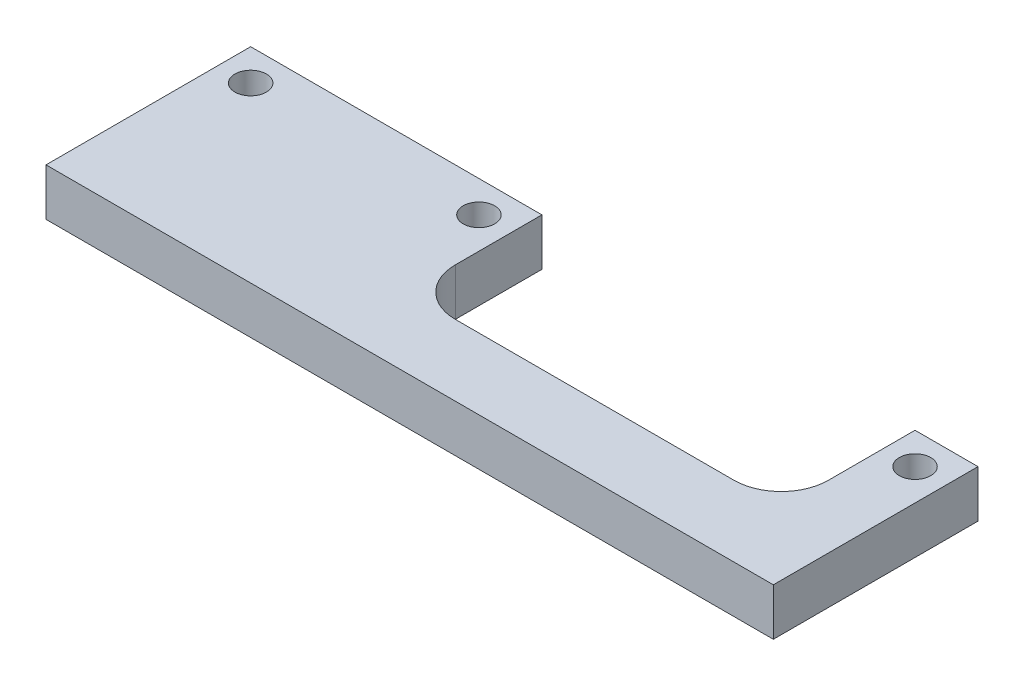
ISO-10303-21;
HEADER;
FILE_DESCRIPTION(('STEP AP214'),'2;1');
FILE_NAME('part.step','',(''),(''),'','','');
FILE_SCHEMA(('AUTOMOTIVE_DESIGN { 1 0 10303 214 1 1 1 1 }'));
ENDSEC;
DATA;
#1=APPLICATION_CONTEXT('core data for automotive mechanical design processes');
#2=APPLICATION_PROTOCOL_DEFINITION('international standard','automotive_design',2000,#1);
#3=PRODUCT_CONTEXT('',#1,'mechanical');
#4=PRODUCT('Part','Part','',(#3));
#5=PRODUCT_RELATED_PRODUCT_CATEGORY('part','',(#4));
#6=PRODUCT_DEFINITION_FORMATION('','',#4);
#7=PRODUCT_DEFINITION_CONTEXT('part definition',#1,'design');
#8=PRODUCT_DEFINITION('design','',#6,#7);
#9=PRODUCT_DEFINITION_SHAPE('','',#8);
#10=(LENGTH_UNIT() NAMED_UNIT(*) SI_UNIT(.MILLI.,.METRE.));
#11=(NAMED_UNIT(*) PLANE_ANGLE_UNIT() SI_UNIT($,.RADIAN.));
#12=(NAMED_UNIT(*) SI_UNIT($,.STERADIAN.) SOLID_ANGLE_UNIT());
#13=UNCERTAINTY_MEASURE_WITH_UNIT(LENGTH_MEASURE(1.E-05),#10,'distance_accuracy_value','');
#14=(GEOMETRIC_REPRESENTATION_CONTEXT(3) GLOBAL_UNCERTAINTY_ASSIGNED_CONTEXT((#13)) GLOBAL_UNIT_ASSIGNED_CONTEXT((#10,
#11,#12)) REPRESENTATION_CONTEXT('',''));
#15=CARTESIAN_POINT('',(0.,0.,0.));
#16=DIRECTION('',(0.,0.,1.));
#17=DIRECTION('',(1.,0.,0.));
#18=AXIS2_PLACEMENT_3D('',#15,#16,#17);
#19=CARTESIAN_POINT('',(-23.1,1.5,-6.5));
#20=DIRECTION('',(0.,0.,1.));
#21=DIRECTION('',(1.,0.,0.));
#22=AXIS2_PLACEMENT_3D('',#19,#20,#21);
#23=PLANE('',#22);
#24=DIRECTION('',(-1.,0.,0.));
#25=VECTOR('',#24,1.);
#26=CARTESIAN_POINT('',(-23.1,1.5,-6.5));
#27=LINE('',#26,#25);
#28=CARTESIAN_POINT('',(-4.6,1.5,-6.5));
#29=VERTEX_POINT('',#28);
#30=CARTESIAN_POINT('',(-23.1,1.5,-6.5));
#31=VERTEX_POINT('',#30);
#32=EDGE_CURVE('E345',#29,#31,#27,.T.);
#33=ORIENTED_EDGE('',*,*,#32,.F.);
#34=DIRECTION('',(0.,1.,0.));
#35=VECTOR('',#34,1.);
#36=CARTESIAN_POINT('',(-4.6,-1.5,-6.5));
#37=LINE('',#36,#35);
#38=CARTESIAN_POINT('',(-4.6,-1.5,-6.5));
#39=VERTEX_POINT('',#38);
#40=EDGE_CURVE('E131',#39,#29,#37,.T.);
#41=ORIENTED_EDGE('',*,*,#40,.F.);
#42=DIRECTION('',(-1.,0.,0.));
#43=VECTOR('',#42,1.);
#44=CARTESIAN_POINT('',(-23.1,-1.5,-6.5));
#45=LINE('',#44,#43);
#46=CARTESIAN_POINT('',(-23.1,-1.5,-6.5));
#47=VERTEX_POINT('',#46);
#48=EDGE_CURVE('E138',#39,#47,#45,.T.);
#49=ORIENTED_EDGE('',*,*,#48,.T.);
#50=DIRECTION('',(0.,-1.,0.));
#51=VECTOR('',#50,1.);
#52=CARTESIAN_POINT('',(-23.1,1.5,-6.5));
#53=LINE('',#52,#51);
#54=EDGE_CURVE('E155',#31,#47,#53,.T.);
#55=ORIENTED_EDGE('',*,*,#54,.F.);
#56=EDGE_LOOP('',(#33,#41,#49,#55));
#57=FACE_BOUND('',#56,.T.);
#58=ADVANCED_FACE('F33',(#57),#23,.F.);
#59=CARTESIAN_POINT('',(23.1,1.5,6.5));
#60=DIRECTION('',(-1.,0.,0.));
#61=DIRECTION('',(0.,0.,1.));
#62=AXIS2_PLACEMENT_3D('',#59,#60,#61);
#63=PLANE('',#62);
#64=DIRECTION('',(0.,0.,-1.));
#65=VECTOR('',#64,1.);
#66=CARTESIAN_POINT('',(23.1,-1.5,6.5));
#67=LINE('',#66,#65);
#68=CARTESIAN_POINT('',(23.1,-1.5,6.5));
#69=VERTEX_POINT('',#68);
#70=CARTESIAN_POINT('',(23.1,-1.5,-6.5));
#71=VERTEX_POINT('',#70);
#72=EDGE_CURVE('E142',#69,#71,#67,.T.);
#73=ORIENTED_EDGE('',*,*,#72,.T.);
#74=DIRECTION('',(0.,-1.,0.));
#75=VECTOR('',#74,1.);
#76=CARTESIAN_POINT('',(23.1,1.5,-6.5));
#77=LINE('',#76,#75);
#78=CARTESIAN_POINT('',(23.1,1.5,-6.5));
#79=VERTEX_POINT('',#78);
#80=EDGE_CURVE('E135',#79,#71,#77,.T.);
#81=ORIENTED_EDGE('',*,*,#80,.F.);
#82=DIRECTION('',(0.,0.,-1.));
#83=VECTOR('',#82,1.);
#84=CARTESIAN_POINT('',(23.1,1.5,6.5));
#85=LINE('',#84,#83);
#86=CARTESIAN_POINT('',(23.1,1.5,6.5));
#87=VERTEX_POINT('',#86);
#88=EDGE_CURVE('E147',#87,#79,#85,.T.);
#89=ORIENTED_EDGE('',*,*,#88,.F.);
#90=DIRECTION('',(0.,-1.,0.));
#91=VECTOR('',#90,1.);
#92=CARTESIAN_POINT('',(23.1,1.5,6.5));
#93=LINE('',#92,#91);
#94=EDGE_CURVE('E148',#87,#69,#93,.T.);
#95=ORIENTED_EDGE('',*,*,#94,.T.);
#96=EDGE_LOOP('',(#73,#81,#89,#95));
#97=FACE_BOUND('',#96,.T.);
#98=ADVANCED_FACE('F190',(#97),#63,.F.);
#99=CARTESIAN_POINT('',(19.1,-1.5,-6.5));
#100=VERTEX_POINT('',#99);
#101=EDGE_CURVE('E114',#71,#100,#45,.T.);
#102=ORIENTED_EDGE('',*,*,#101,.T.);
#103=DIRECTION('',(0.,1.,0.));
#104=VECTOR('',#103,1.);
#105=CARTESIAN_POINT('',(19.1,-1.5,-6.5));
#106=LINE('',#105,#104);
#107=CARTESIAN_POINT('',(19.1,1.5,-6.5));
#108=VERTEX_POINT('',#107);
#109=EDGE_CURVE('E122',#100,#108,#106,.T.);
#110=ORIENTED_EDGE('',*,*,#109,.T.);
#111=EDGE_CURVE('E346',#79,#108,#27,.T.);
#112=ORIENTED_EDGE('',*,*,#111,.F.);
#113=ORIENTED_EDGE('',*,*,#80,.T.);
#114=EDGE_LOOP('',(#102,#110,#112,#113));
#115=FACE_BOUND('',#114,.T.);
#116=ADVANCED_FACE('F133',(#115),#23,.F.);
#117=CARTESIAN_POINT('',(-23.1,1.5,6.5));
#118=DIRECTION('',(1.,0.,0.));
#119=DIRECTION('',(0.,0.,-1.));
#120=AXIS2_PLACEMENT_3D('',#117,#118,#119);
#121=PLANE('',#120);
#122=DIRECTION('',(0.,0.,1.));
#123=VECTOR('',#122,1.);
#124=CARTESIAN_POINT('',(-23.1,-1.5,6.5));
#125=LINE('',#124,#123);
#126=CARTESIAN_POINT('',(-23.1,-1.5,6.5));
#127=VERTEX_POINT('',#126);
#128=EDGE_CURVE('E137',#47,#127,#125,.T.);
#129=ORIENTED_EDGE('',*,*,#128,.T.);
#130=DIRECTION('',(0.,-1.,0.));
#131=VECTOR('',#130,1.);
#132=CARTESIAN_POINT('',(-23.1,1.5,6.5));
#133=LINE('',#132,#131);
#134=CARTESIAN_POINT('',(-23.1,1.5,6.5));
#135=VERTEX_POINT('',#134);
#136=EDGE_CURVE('E151',#135,#127,#133,.T.);
#137=ORIENTED_EDGE('',*,*,#136,.F.);
#138=DIRECTION('',(0.,0.,1.));
#139=VECTOR('',#138,1.);
#140=CARTESIAN_POINT('',(-23.1,1.5,6.5));
#141=LINE('',#140,#139);
#142=EDGE_CURVE('E348',#31,#135,#141,.T.);
#143=ORIENTED_EDGE('',*,*,#142,.F.);
#144=ORIENTED_EDGE('',*,*,#54,.T.);
#145=EDGE_LOOP('',(#129,#137,#143,#144));
#146=FACE_BOUND('',#145,.T.);
#147=ADVANCED_FACE('F200',(#146),#121,.F.);
#148=CARTESIAN_POINT('',(-23.1,1.5,6.5));
#149=DIRECTION('',(0.,0.,-1.));
#150=DIRECTION('',(-1.,0.,0.));
#151=AXIS2_PLACEMENT_3D('',#148,#149,#150);
#152=PLANE('',#151);
#153=DIRECTION('',(1.,0.,0.));
#154=VECTOR('',#153,1.);
#155=CARTESIAN_POINT('',(-23.1,-1.5,6.5));
#156=LINE('',#155,#154);
#157=EDGE_CURVE('E140',#127,#69,#156,.T.);
#158=ORIENTED_EDGE('',*,*,#157,.T.);
#159=ORIENTED_EDGE('',*,*,#94,.F.);
#160=DIRECTION('',(1.,0.,0.));
#161=VECTOR('',#160,1.);
#162=CARTESIAN_POINT('',(-23.1,1.5,6.5));
#163=LINE('',#162,#161);
#164=EDGE_CURVE('E152',#135,#87,#163,.T.);
#165=ORIENTED_EDGE('',*,*,#164,.F.);
#166=ORIENTED_EDGE('',*,*,#136,.T.);
#167=EDGE_LOOP('',(#158,#159,#165,#166));
#168=FACE_BOUND('',#167,.T.);
#169=ADVANCED_FACE('F204',(#168),#152,.F.);
#170=CARTESIAN_POINT('',(0.,1.5,0.));
#171=DIRECTION('',(0.,-1.,0.));
#172=DIRECTION('',(0.,0.,-1.));
#173=AXIS2_PLACEMENT_3D('',#170,#171,#172);
#174=PLANE('',#173);
#175=CARTESIAN_POINT('',(-21.1,1.5,-4.5));
#176=DIRECTION('',(0.,1.,0.));
#177=DIRECTION('',(0.,0.,1.));
#178=AXIS2_PLACEMENT_3D('',#175,#176,#177);
#179=CIRCLE('',#178,1.);
#180=CARTESIAN_POINT('',(-21.1,1.5,-3.5));
#181=VERTEX_POINT('',#180);
#182=EDGE_CURVE('E329',#181,#181,#179,.T.);
#183=ORIENTED_EDGE('',*,*,#182,.F.);
#184=EDGE_LOOP('',(#183));
#185=FACE_BOUND('',#184,.T.);
#186=CARTESIAN_POINT('',(-6.6,1.5,-4.5));
#187=DIRECTION('',(0.,1.,0.));
#188=DIRECTION('',(0.,0.,1.));
#189=AXIS2_PLACEMENT_3D('',#186,#187,#188);
#190=CIRCLE('',#189,1.);
#191=CARTESIAN_POINT('',(-6.6,1.5,-3.5));
#192=VERTEX_POINT('',#191);
#193=EDGE_CURVE('E335',#192,#192,#190,.T.);
#194=ORIENTED_EDGE('',*,*,#193,.F.);
#195=EDGE_LOOP('',(#194));
#196=FACE_BOUND('',#195,.T.);
#197=CARTESIAN_POINT('',(21.1,1.5,-4.5));
#198=DIRECTION('',(0.,1.,0.));
#199=DIRECTION('',(0.,0.,1.));
#200=AXIS2_PLACEMENT_3D('',#197,#198,#199);
#201=CIRCLE('',#200,1.);
#202=CARTESIAN_POINT('',(21.1,1.5,-3.5));
#203=VERTEX_POINT('',#202);
#204=EDGE_CURVE('E324',#203,#203,#201,.T.);
#205=ORIENTED_EDGE('',*,*,#204,.F.);
#206=EDGE_LOOP('',(#205));
#207=FACE_BOUND('',#206,.T.);
#208=DIRECTION('',(1.,0.,0.));
#209=VECTOR('',#208,1.);
#210=CARTESIAN_POINT('',(-4.6,1.5,2.));
#211=LINE('',#210,#209);
#212=CARTESIAN_POINT('',(-1.6,1.5,2.));
#213=VERTEX_POINT('',#212);
#214=CARTESIAN_POINT('',(16.1,1.5,2.));
#215=VERTEX_POINT('',#214);
#216=EDGE_CURVE('E171',#213,#215,#211,.T.);
#217=ORIENTED_EDGE('',*,*,#216,.F.);
#218=CARTESIAN_POINT('',(-1.6,1.5,-0.999999999999999));
#219=DIRECTION('',(0.,-1.,0.));
#220=DIRECTION('',(0.,0.,-1.));
#221=AXIS2_PLACEMENT_3D('',#218,#219,#220);
#222=CIRCLE('',#221,3.);
#223=CARTESIAN_POINT('',(-4.6,1.5,-0.999999999999999));
#224=VERTEX_POINT('',#223);
#225=EDGE_CURVE('E41',#213,#224,#222,.T.);
#226=ORIENTED_EDGE('',*,*,#225,.T.);
#227=DIRECTION('',(0.,0.,1.));
#228=VECTOR('',#227,1.);
#229=CARTESIAN_POINT('',(-4.6,1.5,-6.5));
#230=LINE('',#229,#228);
#231=EDGE_CURVE('E178',#29,#224,#230,.T.);
#232=ORIENTED_EDGE('',*,*,#231,.F.);
#233=ORIENTED_EDGE('',*,*,#32,.T.);
#234=ORIENTED_EDGE('',*,*,#142,.T.);
#235=ORIENTED_EDGE('',*,*,#164,.T.);
#236=ORIENTED_EDGE('',*,*,#88,.T.);
#237=ORIENTED_EDGE('',*,*,#111,.T.);
#238=DIRECTION('',(0.,0.,-1.));
#239=VECTOR('',#238,1.);
#240=CARTESIAN_POINT('',(19.1,1.5,-6.5));
#241=LINE('',#240,#239);
#242=CARTESIAN_POINT('',(19.1,1.5,-0.999999999999999));
#243=VERTEX_POINT('',#242);
#244=EDGE_CURVE('E128',#243,#108,#241,.T.);
#245=ORIENTED_EDGE('',*,*,#244,.F.);
#246=CARTESIAN_POINT('',(16.1,1.5,-0.999999999999999));
#247=DIRECTION('',(0.,-1.,0.));
#248=DIRECTION('',(0.,0.,-1.));
#249=AXIS2_PLACEMENT_3D('',#246,#247,#248);
#250=CIRCLE('',#249,3.);
#251=EDGE_CURVE('E167',#243,#215,#250,.T.);
#252=ORIENTED_EDGE('',*,*,#251,.T.);
#253=EDGE_LOOP('',(#217,#226,#232,#233,#234,#235,#236,#237,#245,#252));
#254=FACE_BOUND('',#253,.T.);
#255=ADVANCED_FACE('F170',(#185,#196,#207,#254),#174,.F.);
#256=CARTESIAN_POINT('',(0.,-1.5,0.));
#257=DIRECTION('',(0.,-1.,0.));
#258=DIRECTION('',(0.,0.,-1.));
#259=AXIS2_PLACEMENT_3D('',#256,#257,#258);
#260=PLANE('',#259);
#261=DIRECTION('',(0.,0.,1.));
#262=VECTOR('',#261,1.);
#263=CARTESIAN_POINT('',(-4.6,-1.5,-6.5));
#264=LINE('',#263,#262);
#265=CARTESIAN_POINT('',(-4.6,-1.5,-0.999999999999999));
#266=VERTEX_POINT('',#265);
#267=EDGE_CURVE('E319',#39,#266,#264,.T.);
#268=ORIENTED_EDGE('',*,*,#267,.T.);
#269=CARTESIAN_POINT('',(-1.6,-1.5,-0.999999999999999));
#270=DIRECTION('',(0.,-1.,0.));
#271=DIRECTION('',(0.,0.,-1.));
#272=AXIS2_PLACEMENT_3D('',#269,#270,#271);
#273=CIRCLE('',#272,3.);
#274=CARTESIAN_POINT('',(-1.6,-1.5,2.));
#275=VERTEX_POINT('',#274);
#276=EDGE_CURVE('E11',#266,#275,#273,.F.);
#277=ORIENTED_EDGE('',*,*,#276,.T.);
#278=DIRECTION('',(1.,0.,0.));
#279=VECTOR('',#278,1.);
#280=CARTESIAN_POINT('',(-4.6,-1.5,2.));
#281=LINE('',#280,#279);
#282=CARTESIAN_POINT('',(16.1,-1.5,2.));
#283=VERTEX_POINT('',#282);
#284=EDGE_CURVE('E123',#275,#283,#281,.T.);
#285=ORIENTED_EDGE('',*,*,#284,.T.);
#286=CARTESIAN_POINT('',(16.1,-1.5,-0.999999999999999));
#287=DIRECTION('',(0.,-1.,0.));
#288=DIRECTION('',(0.,0.,-1.));
#289=AXIS2_PLACEMENT_3D('',#286,#287,#288);
#290=CIRCLE('',#289,3.);
#291=CARTESIAN_POINT('',(19.1,-1.5,-0.999999999999999));
#292=VERTEX_POINT('',#291);
#293=EDGE_CURVE('E118',#283,#292,#290,.F.);
#294=ORIENTED_EDGE('',*,*,#293,.T.);
#295=DIRECTION('',(0.,0.,-1.));
#296=VECTOR('',#295,1.);
#297=CARTESIAN_POINT('',(19.1,-1.5,-6.5));
#298=LINE('',#297,#296);
#299=EDGE_CURVE('E108',#292,#100,#298,.T.);
#300=ORIENTED_EDGE('',*,*,#299,.T.);
#301=ORIENTED_EDGE('',*,*,#101,.F.);
#302=ORIENTED_EDGE('',*,*,#72,.F.);
#303=ORIENTED_EDGE('',*,*,#157,.F.);
#304=ORIENTED_EDGE('',*,*,#128,.F.);
#305=ORIENTED_EDGE('',*,*,#48,.F.);
#306=EDGE_LOOP('',(#268,#277,#285,#294,#300,#301,#302,#303,#304,#305));
#307=FACE_BOUND('',#306,.T.);
#308=CARTESIAN_POINT('',(-21.1,-1.5,-4.5));
#309=DIRECTION('',(0.,1.,0.));
#310=DIRECTION('',(0.,0.,1.));
#311=AXIS2_PLACEMENT_3D('',#308,#309,#310);
#312=CIRCLE('',#311,1.);
#313=CARTESIAN_POINT('',(-21.1,-1.5,-3.5));
#314=VERTEX_POINT('',#313);
#315=EDGE_CURVE('E326',#314,#314,#312,.T.);
#316=ORIENTED_EDGE('',*,*,#315,.T.);
#317=EDGE_LOOP('',(#316));
#318=FACE_BOUND('',#317,.T.);
#319=CARTESIAN_POINT('',(-6.6,-1.5,-4.5));
#320=DIRECTION('',(0.,1.,0.));
#321=DIRECTION('',(0.,0.,1.));
#322=AXIS2_PLACEMENT_3D('',#319,#320,#321);
#323=CIRCLE('',#322,1.);
#324=CARTESIAN_POINT('',(-6.6,-1.5,-3.5));
#325=VERTEX_POINT('',#324);
#326=EDGE_CURVE('E332',#325,#325,#323,.T.);
#327=ORIENTED_EDGE('',*,*,#326,.T.);
#328=EDGE_LOOP('',(#327));
#329=FACE_BOUND('',#328,.T.);
#330=CARTESIAN_POINT('',(21.1,-1.5,-4.5));
#331=DIRECTION('',(0.,1.,0.));
#332=DIRECTION('',(0.,0.,1.));
#333=AXIS2_PLACEMENT_3D('',#330,#331,#332);
#334=CIRCLE('',#333,1.);
#335=CARTESIAN_POINT('',(21.1,-1.5,-3.5));
#336=VERTEX_POINT('',#335);
#337=EDGE_CURVE('E338',#336,#336,#334,.T.);
#338=ORIENTED_EDGE('',*,*,#337,.T.);
#339=EDGE_LOOP('',(#338));
#340=FACE_BOUND('',#339,.T.);
#341=ADVANCED_FACE('F110',(#307,#318,#329,#340),#260,.T.);
#342=CARTESIAN_POINT('',(21.1,-1.5,-4.5));
#343=DIRECTION('',(0.,1.,0.));
#344=DIRECTION('',(0.,0.,1.));
#345=AXIS2_PLACEMENT_3D('',#342,#343,#344);
#346=CYLINDRICAL_SURFACE('',#345,1.);
#347=ORIENTED_EDGE('',*,*,#337,.F.);
#348=EDGE_LOOP('',(#347));
#349=FACE_BOUND('',#348,.T.);
#350=ORIENTED_EDGE('',*,*,#204,.T.);
#351=EDGE_LOOP('',(#350));
#352=FACE_BOUND('',#351,.T.);
#353=ADVANCED_FACE('F214',(#349,#352),#346,.F.);
#354=CARTESIAN_POINT('',(-6.6,-1.5,-4.5));
#355=DIRECTION('',(0.,1.,0.));
#356=DIRECTION('',(0.,0.,1.));
#357=AXIS2_PLACEMENT_3D('',#354,#355,#356);
#358=CYLINDRICAL_SURFACE('',#357,1.);
#359=ORIENTED_EDGE('',*,*,#326,.F.);
#360=EDGE_LOOP('',(#359));
#361=FACE_BOUND('',#360,.T.);
#362=ORIENTED_EDGE('',*,*,#193,.T.);
#363=EDGE_LOOP('',(#362));
#364=FACE_BOUND('',#363,.T.);
#365=ADVANCED_FACE('F220',(#361,#364),#358,.F.);
#366=CARTESIAN_POINT('',(-21.1,-1.5,-4.5));
#367=DIRECTION('',(0.,1.,0.));
#368=DIRECTION('',(0.,0.,1.));
#369=AXIS2_PLACEMENT_3D('',#366,#367,#368);
#370=CYLINDRICAL_SURFACE('',#369,1.);
#371=ORIENTED_EDGE('',*,*,#315,.F.);
#372=EDGE_LOOP('',(#371));
#373=FACE_BOUND('',#372,.T.);
#374=ORIENTED_EDGE('',*,*,#182,.T.);
#375=EDGE_LOOP('',(#374));
#376=FACE_BOUND('',#375,.T.);
#377=ADVANCED_FACE('F224',(#373,#376),#370,.F.);
#378=CARTESIAN_POINT('',(-4.6,-1.5,-6.5));
#379=DIRECTION('',(-1.,0.,0.));
#380=DIRECTION('',(0.,0.,1.));
#381=AXIS2_PLACEMENT_3D('',#378,#379,#380);
#382=PLANE('',#381);
#383=ORIENTED_EDGE('',*,*,#231,.T.);
#384=DIRECTION('',(0.,1.,0.));
#385=VECTOR('',#384,1.);
#386=CARTESIAN_POINT('',(-4.6,-1.5,-0.999999999999999));
#387=LINE('',#386,#385);
#388=EDGE_CURVE('E48',#224,#266,#387,.F.);
#389=ORIENTED_EDGE('',*,*,#388,.T.);
#390=ORIENTED_EDGE('',*,*,#267,.F.);
#391=ORIENTED_EDGE('',*,*,#40,.T.);
#392=EDGE_LOOP('',(#383,#389,#390,#391));
#393=FACE_BOUND('',#392,.T.);
#394=ADVANCED_FACE('F228',(#393),#382,.F.);
#395=CARTESIAN_POINT('',(19.1,-1.5,-6.5));
#396=DIRECTION('',(1.,0.,0.));
#397=DIRECTION('',(0.,0.,-1.));
#398=AXIS2_PLACEMENT_3D('',#395,#396,#397);
#399=PLANE('',#398);
#400=ORIENTED_EDGE('',*,*,#299,.F.);
#401=DIRECTION('',(0.,1.,0.));
#402=VECTOR('',#401,1.);
#403=CARTESIAN_POINT('',(19.1,1.5,-0.999999999999999));
#404=LINE('',#403,#402);
#405=EDGE_CURVE('E159',#292,#243,#404,.T.);
#406=ORIENTED_EDGE('',*,*,#405,.T.);
#407=ORIENTED_EDGE('',*,*,#244,.T.);
#408=ORIENTED_EDGE('',*,*,#109,.F.);
#409=EDGE_LOOP('',(#400,#406,#407,#408));
#410=FACE_BOUND('',#409,.T.);
#411=ADVANCED_FACE('F126',(#410),#399,.F.);
#412=CARTESIAN_POINT('',(-4.6,-1.5,2.));
#413=DIRECTION('',(0.,0.,1.));
#414=DIRECTION('',(1.,0.,0.));
#415=AXIS2_PLACEMENT_3D('',#412,#413,#414);
#416=PLANE('',#415);
#417=ORIENTED_EDGE('',*,*,#216,.T.);
#418=DIRECTION('',(0.,1.,0.));
#419=VECTOR('',#418,1.);
#420=CARTESIAN_POINT('',(16.1,-1.5,2.));
#421=LINE('',#420,#419);
#422=EDGE_CURVE('E164',#215,#283,#421,.F.);
#423=ORIENTED_EDGE('',*,*,#422,.T.);
#424=ORIENTED_EDGE('',*,*,#284,.F.);
#425=DIRECTION('',(0.,1.,0.));
#426=VECTOR('',#425,1.);
#427=CARTESIAN_POINT('',(-1.6,1.5,2.));
#428=LINE('',#427,#426);
#429=EDGE_CURVE('E161',#275,#213,#428,.T.);
#430=ORIENTED_EDGE('',*,*,#429,.T.);
#431=EDGE_LOOP('',(#417,#423,#424,#430));
#432=FACE_BOUND('',#431,.T.);
#433=ADVANCED_FACE('F175',(#432),#416,.F.);
#434=CARTESIAN_POINT('',(16.1,-1.5,-0.999999999999999));
#435=DIRECTION('',(0.,-1.,0.));
#436=DIRECTION('',(0.,0.,-1.));
#437=AXIS2_PLACEMENT_3D('',#434,#435,#436);
#438=CYLINDRICAL_SURFACE('',#437,3.);
#439=ORIENTED_EDGE('',*,*,#293,.F.);
#440=ORIENTED_EDGE('',*,*,#422,.F.);
#441=ORIENTED_EDGE('',*,*,#251,.F.);
#442=ORIENTED_EDGE('',*,*,#405,.F.);
#443=EDGE_LOOP('',(#439,#440,#441,#442));
#444=FACE_BOUND('',#443,.T.);
#445=ADVANCED_FACE('F180',(#444),#438,.F.);
#446=CARTESIAN_POINT('',(-1.6,-1.5,-0.999999999999999));
#447=DIRECTION('',(0.,-1.,0.));
#448=DIRECTION('',(0.,0.,-1.));
#449=AXIS2_PLACEMENT_3D('',#446,#447,#448);
#450=CYLINDRICAL_SURFACE('',#449,3.);
#451=ORIENTED_EDGE('',*,*,#276,.F.);
#452=ORIENTED_EDGE('',*,*,#388,.F.);
#453=ORIENTED_EDGE('',*,*,#225,.F.);
#454=ORIENTED_EDGE('',*,*,#429,.F.);
#455=EDGE_LOOP('',(#451,#452,#453,#454));
#456=FACE_BOUND('',#455,.T.);
#457=ADVANCED_FACE('F35',(#456),#450,.F.);
#458=CLOSED_SHELL('',(#58,#98,#116,#147,#169,#255,#341,#353,#365,#377,#394,#411,#433,#445,#457));
#459=MANIFOLD_SOLID_BREP('B2',#458);
#460=ADVANCED_BREP_SHAPE_REPRESENTATION('',(#18,#459),#14);
#461=SHAPE_DEFINITION_REPRESENTATION(#9,#460);
ENDSEC;
END-ISO-10303-21;
